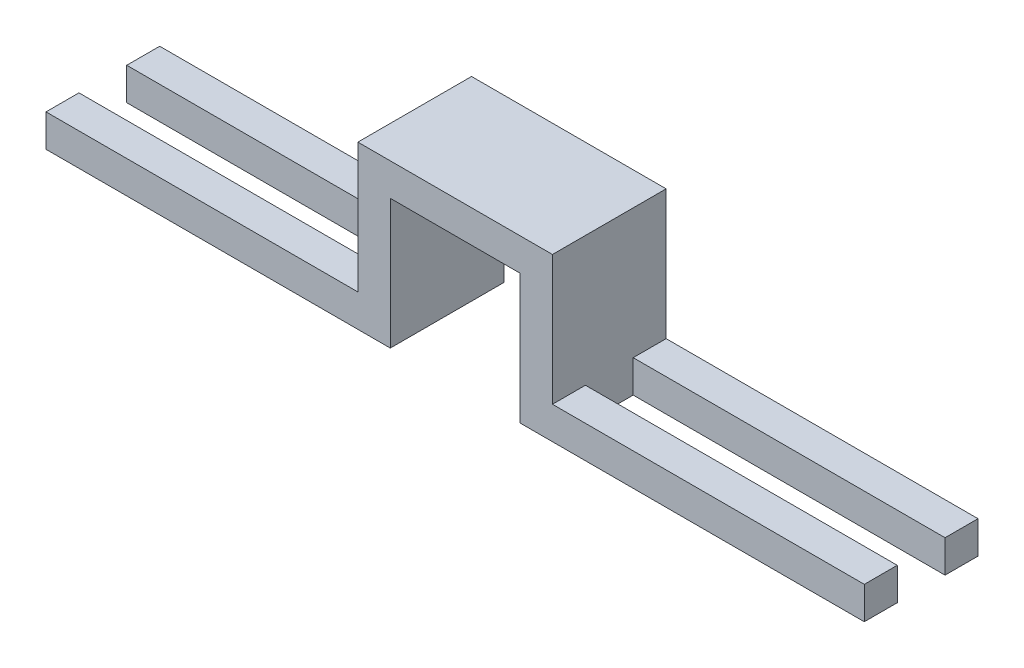
ISO-10303-21;
HEADER;
FILE_DESCRIPTION(('STEP AP214'),'2;1');
FILE_NAME('part.step','',(''),(''),'','','');
FILE_SCHEMA(('AUTOMOTIVE_DESIGN { 1 0 10303 214 1 1 1 1 }'));
ENDSEC;
DATA;
#1=APPLICATION_CONTEXT('core data for automotive mechanical design processes');
#2=APPLICATION_PROTOCOL_DEFINITION('international standard','automotive_design',2000,#1);
#3=PRODUCT_CONTEXT('',#1,'mechanical');
#4=PRODUCT('Part','Part','',(#3));
#5=PRODUCT_RELATED_PRODUCT_CATEGORY('part','',(#4));
#6=PRODUCT_DEFINITION_FORMATION('','',#4);
#7=PRODUCT_DEFINITION_CONTEXT('part definition',#1,'design');
#8=PRODUCT_DEFINITION('design','',#6,#7);
#9=PRODUCT_DEFINITION_SHAPE('','',#8);
#10=(LENGTH_UNIT() NAMED_UNIT(*) SI_UNIT(.MILLI.,.METRE.));
#11=(NAMED_UNIT(*) PLANE_ANGLE_UNIT() SI_UNIT($,.RADIAN.));
#12=(NAMED_UNIT(*) SI_UNIT($,.STERADIAN.) SOLID_ANGLE_UNIT());
#13=UNCERTAINTY_MEASURE_WITH_UNIT(LENGTH_MEASURE(1.E-05),#10,'distance_accuracy_value','');
#14=(GEOMETRIC_REPRESENTATION_CONTEXT(3) GLOBAL_UNCERTAINTY_ASSIGNED_CONTEXT((#13)) GLOBAL_UNIT_ASSIGNED_CONTEXT((#10,
#11,#12)) REPRESENTATION_CONTEXT('',''));
#15=CARTESIAN_POINT('',(0.,0.,0.));
#16=DIRECTION('',(0.,0.,1.));
#17=DIRECTION('',(1.,0.,0.));
#18=AXIS2_PLACEMENT_3D('',#15,#16,#17);
#19=CARTESIAN_POINT('',(0.,-10.0000000000001,17.526));
#20=DIRECTION('',(0.,1.,0.));
#21=DIRECTION('',(0.,0.,1.));
#22=AXIS2_PLACEMENT_3D('',#19,#20,#21);
#23=PLANE('',#22);
#24=DIRECTION('',(1.,0.,0.));
#25=VECTOR('',#24,1.);
#26=CARTESIAN_POINT('',(0.,-10.0000000000001,5.08));
#27=LINE('',#26,#25);
#28=CARTESIAN_POINT('',(14.9999999999999,-10.0000000000001,5.08));
#29=VERTEX_POINT('',#28);
#30=CARTESIAN_POINT('',(63.0734845670397,-10.0000000000001,5.08000000000001));
#31=VERTEX_POINT('',#30);
#32=EDGE_CURVE('E209',#29,#31,#27,.T.);
#33=ORIENTED_EDGE('',*,*,#32,.F.);
#34=DIRECTION('',(0.,0.,1.));
#35=VECTOR('',#34,1.);
#36=CARTESIAN_POINT('',(14.9999999999999,-10.0000000000001,0.));
#37=LINE('',#36,#35);
#38=CARTESIAN_POINT('',(14.9999999999999,-10.0000000000001,12.446));
#39=VERTEX_POINT('',#38);
#40=EDGE_CURVE('E212',#29,#39,#37,.T.);
#41=ORIENTED_EDGE('',*,*,#40,.T.);
#42=DIRECTION('',(1.,0.,0.));
#43=VECTOR('',#42,1.);
#44=CARTESIAN_POINT('',(0.,-10.0000000000001,12.446));
#45=LINE('',#44,#43);
#46=CARTESIAN_POINT('',(63.0734845670397,-10.0000000000001,12.446));
#47=VERTEX_POINT('',#46);
#48=EDGE_CURVE('E216',#39,#47,#45,.T.);
#49=ORIENTED_EDGE('',*,*,#48,.T.);
#50=DIRECTION('',(0.,0.,-1.));
#51=VECTOR('',#50,1.);
#52=CARTESIAN_POINT('',(63.0734845670397,-9.99999999999939,17.526));
#53=LINE('',#52,#51);
#54=CARTESIAN_POINT('',(63.0734845670397,-9.99999999999939,17.526));
#55=VERTEX_POINT('',#54);
#56=EDGE_CURVE('E11',#55,#47,#53,.T.);
#57=ORIENTED_EDGE('',*,*,#56,.F.);
#58=DIRECTION('',(1.,0.,0.));
#59=VECTOR('',#58,1.);
#60=CARTESIAN_POINT('',(0.,-10.0000000000001,17.526));
#61=LINE('',#60,#59);
#62=CARTESIAN_POINT('',(9.99999999999994,-10.0000000000001,17.526));
#63=VERTEX_POINT('',#62);
#64=EDGE_CURVE('E250',#63,#55,#61,.T.);
#65=ORIENTED_EDGE('',*,*,#64,.F.);
#66=DIRECTION('',(0.,0.,-1.));
#67=VECTOR('',#66,1.);
#68=CARTESIAN_POINT('',(9.99999999999994,-10.0000000000001,17.526));
#69=LINE('',#68,#67);
#70=CARTESIAN_POINT('',(9.99999999999994,-10.0000000000001,0.));
#71=VERTEX_POINT('',#70);
#72=EDGE_CURVE('E294',#63,#71,#69,.T.);
#73=ORIENTED_EDGE('',*,*,#72,.T.);
#74=DIRECTION('',(1.,0.,0.));
#75=VECTOR('',#74,1.);
#76=CARTESIAN_POINT('',(0.,-10.0000000000001,0.));
#77=LINE('',#76,#75);
#78=CARTESIAN_POINT('',(63.0734845670397,-9.99999999999939,0.));
#79=VERTEX_POINT('',#78);
#80=EDGE_CURVE('E249',#71,#79,#77,.T.);
#81=ORIENTED_EDGE('',*,*,#80,.T.);
#82=EDGE_CURVE('E49',#31,#79,#53,.T.);
#83=ORIENTED_EDGE('',*,*,#82,.F.);
#84=EDGE_LOOP('',(#33,#41,#49,#57,#65,#73,#81,#83));
#85=FACE_BOUND('',#84,.T.);
#86=ADVANCED_FACE('F41',(#85),#23,.F.);
#87=CARTESIAN_POINT('',(63.0734845670399,-1.40051269619353E-12,17.526));
#88=DIRECTION('',(-1.,0.,0.));
#89=DIRECTION('',(0.,-1.,0.));
#90=AXIS2_PLACEMENT_3D('',#87,#88,#89);
#91=PLANE('',#90);
#92=DIRECTION('',(0.,1.,0.));
#93=VECTOR('',#92,1.);
#94=CARTESIAN_POINT('',(63.0734845670399,-1.40051269619353E-12,5.08000000000001));
#95=LINE('',#94,#93);
#96=CARTESIAN_POINT('',(63.0734845670398,-5.00000000000006,5.08000000000001));
#97=VERTEX_POINT('',#96);
#98=EDGE_CURVE('E246',#31,#97,#95,.T.);
#99=ORIENTED_EDGE('',*,*,#98,.F.);
#100=ORIENTED_EDGE('',*,*,#82,.T.);
#101=DIRECTION('',(0.,1.,0.));
#102=VECTOR('',#101,1.);
#103=CARTESIAN_POINT('',(63.0734845670399,-1.40051269619353E-12,0.));
#104=LINE('',#103,#102);
#105=CARTESIAN_POINT('',(63.0734845670398,-5.00000000000006,0.));
#106=VERTEX_POINT('',#105);
#107=EDGE_CURVE('E298',#79,#106,#104,.T.);
#108=ORIENTED_EDGE('',*,*,#107,.T.);
#109=DIRECTION('',(0.,0.,-1.));
#110=VECTOR('',#109,1.);
#111=CARTESIAN_POINT('',(63.0734845670398,-5.00000000000006,17.526));
#112=LINE('',#111,#110);
#113=EDGE_CURVE('E375',#97,#106,#112,.T.);
#114=ORIENTED_EDGE('',*,*,#113,.F.);
#115=EDGE_LOOP('',(#99,#100,#108,#114));
#116=FACE_BOUND('',#115,.T.);
#117=ADVANCED_FACE('F392',(#116),#91,.F.);
#118=CARTESIAN_POINT('',(0.,-5.00000000000006,17.526));
#119=DIRECTION('',(0.,1.,0.));
#120=DIRECTION('',(-1.,0.,0.));
#121=AXIS2_PLACEMENT_3D('',#118,#119,#120);
#122=PLANE('',#121);
#123=DIRECTION('',(0.,0.,-1.));
#124=VECTOR('',#123,1.);
#125=CARTESIAN_POINT('',(14.9999999999999,-5.00000000000006,17.526));
#126=LINE('',#125,#124);
#127=CARTESIAN_POINT('',(14.9999999999999,-5.00000000000006,5.08));
#128=VERTEX_POINT('',#127);
#129=CARTESIAN_POINT('',(14.9999999999999,-5.00000000000006,0.));
#130=VERTEX_POINT('',#129);
#131=EDGE_CURVE('E371',#128,#130,#126,.T.);
#132=ORIENTED_EDGE('',*,*,#131,.F.);
#133=DIRECTION('',(1.,0.,0.));
#134=VECTOR('',#133,1.);
#135=CARTESIAN_POINT('',(0.,-5.00000000000006,5.08));
#136=LINE('',#135,#134);
#137=EDGE_CURVE('E242',#128,#97,#136,.T.);
#138=ORIENTED_EDGE('',*,*,#137,.T.);
#139=ORIENTED_EDGE('',*,*,#113,.T.);
#140=DIRECTION('',(1.,0.,0.));
#141=VECTOR('',#140,1.);
#142=CARTESIAN_POINT('',(0.,-5.00000000000006,0.));
#143=LINE('',#142,#141);
#144=EDGE_CURVE('E302',#130,#106,#143,.T.);
#145=ORIENTED_EDGE('',*,*,#144,.F.);
#146=EDGE_LOOP('',(#132,#138,#139,#145));
#147=FACE_BOUND('',#146,.T.);
#148=ADVANCED_FACE('F388',(#147),#122,.T.);
#149=CARTESIAN_POINT('',(0.,-5.00000000000006,17.526));
#150=DIRECTION('',(0.,-1.,0.));
#151=DIRECTION('',(1.,0.,0.));
#152=AXIS2_PLACEMENT_3D('',#149,#150,#151);
#153=PLANE('',#152);
#154=DIRECTION('',(1.,0.,0.));
#155=VECTOR('',#154,1.);
#156=CARTESIAN_POINT('',(0.,-5.00000000000006,12.446));
#157=LINE('',#156,#155);
#158=CARTESIAN_POINT('',(-63.0734845670398,-5.00000000000007,12.446));
#159=VERTEX_POINT('',#158);
#160=CARTESIAN_POINT('',(-14.9999999999999,-5.00000000000007,12.446));
#161=VERTEX_POINT('',#160);
#162=EDGE_CURVE('E227',#159,#161,#157,.T.);
#163=ORIENTED_EDGE('',*,*,#162,.F.);
#164=DIRECTION('',(0.,0.,-1.));
#165=VECTOR('',#164,1.);
#166=CARTESIAN_POINT('',(-63.0734845670398,-5.00000000000007,17.526));
#167=LINE('',#166,#165);
#168=CARTESIAN_POINT('',(-63.0734845670398,-5.00000000000007,17.526));
#169=VERTEX_POINT('',#168);
#170=EDGE_CURVE('E357',#169,#159,#167,.T.);
#171=ORIENTED_EDGE('',*,*,#170,.F.);
#172=DIRECTION('',(-1.,0.,0.));
#173=VECTOR('',#172,1.);
#174=CARTESIAN_POINT('',(0.,-5.00000000000006,17.526));
#175=LINE('',#174,#173);
#176=CARTESIAN_POINT('',(-14.9999999999999,-5.00000000000007,17.526));
#177=VERTEX_POINT('',#176);
#178=EDGE_CURVE('E273',#177,#169,#175,.T.);
#179=ORIENTED_EDGE('',*,*,#178,.F.);
#180=DIRECTION('',(0.,0.,-1.));
#181=VECTOR('',#180,1.);
#182=CARTESIAN_POINT('',(-14.9999999999999,-5.00000000000007,17.526));
#183=LINE('',#182,#181);
#184=EDGE_CURVE('E361',#177,#161,#183,.T.);
#185=ORIENTED_EDGE('',*,*,#184,.T.);
#186=EDGE_LOOP('',(#163,#171,#179,#185));
#187=FACE_BOUND('',#186,.T.);
#188=ADVANCED_FACE('F434',(#187),#153,.F.);
#189=CARTESIAN_POINT('',(-63.0734845670398,0.,17.526));
#190=DIRECTION('',(-1.,0.,0.));
#191=DIRECTION('',(0.,0.,1.));
#192=AXIS2_PLACEMENT_3D('',#189,#190,#191);
#193=PLANE('',#192);
#194=ORIENTED_EDGE('',*,*,#170,.T.);
#195=DIRECTION('',(0.,-1.,0.));
#196=VECTOR('',#195,1.);
#197=CARTESIAN_POINT('',(-63.0734845670398,0.,12.446));
#198=LINE('',#197,#196);
#199=CARTESIAN_POINT('',(-63.0734845670398,-10.0000000000001,12.446));
#200=VERTEX_POINT('',#199);
#201=EDGE_CURVE('E185',#159,#200,#198,.T.);
#202=ORIENTED_EDGE('',*,*,#201,.T.);
#203=DIRECTION('',(0.,0.,-1.));
#204=VECTOR('',#203,1.);
#205=CARTESIAN_POINT('',(-63.0734845670398,-10.0000000000001,17.526));
#206=LINE('',#205,#204);
#207=CARTESIAN_POINT('',(-63.0734845670398,-10.0000000000001,17.526));
#208=VERTEX_POINT('',#207);
#209=EDGE_CURVE('E353',#208,#200,#206,.T.);
#210=ORIENTED_EDGE('',*,*,#209,.F.);
#211=DIRECTION('',(0.,1.,0.));
#212=VECTOR('',#211,1.);
#213=CARTESIAN_POINT('',(-63.0734845670398,0.,17.526));
#214=LINE('',#213,#212);
#215=EDGE_CURVE('E276',#208,#169,#214,.T.);
#216=ORIENTED_EDGE('',*,*,#215,.T.);
#217=EDGE_LOOP('',(#194,#202,#210,#216));
#218=FACE_BOUND('',#217,.T.);
#219=ADVANCED_FACE('F428',(#218),#193,.T.);
#220=ORIENTED_EDGE('',*,*,#56,.T.);
#221=DIRECTION('',(0.,1.,0.));
#222=VECTOR('',#221,1.);
#223=CARTESIAN_POINT('',(63.0734845670399,-1.40051269619353E-12,12.446));
#224=LINE('',#223,#222);
#225=CARTESIAN_POINT('',(63.0734845670398,-5.00000000000006,12.446));
#226=VERTEX_POINT('',#225);
#227=EDGE_CURVE('E238',#47,#226,#224,.T.);
#228=ORIENTED_EDGE('',*,*,#227,.T.);
#229=CARTESIAN_POINT('',(63.0734845670398,-5.00000000000006,17.526));
#230=VERTEX_POINT('',#229);
#231=EDGE_CURVE('E376',#230,#226,#112,.T.);
#232=ORIENTED_EDGE('',*,*,#231,.F.);
#233=DIRECTION('',(0.,1.,0.));
#234=VECTOR('',#233,1.);
#235=CARTESIAN_POINT('',(63.0734845670399,-1.40051269619353E-12,17.526));
#236=LINE('',#235,#234);
#237=EDGE_CURVE('E254',#55,#230,#236,.T.);
#238=ORIENTED_EDGE('',*,*,#237,.F.);
#239=EDGE_LOOP('',(#220,#228,#232,#238));
#240=FACE_BOUND('',#239,.T.);
#241=ADVANCED_FACE('F457',(#240),#91,.F.);
#242=DIRECTION('',(1.,0.,0.));
#243=VECTOR('',#242,1.);
#244=CARTESIAN_POINT('',(0.,-5.00000000000006,12.446));
#245=LINE('',#244,#243);
#246=CARTESIAN_POINT('',(14.9999999999999,-5.00000000000006,12.446));
#247=VERTEX_POINT('',#246);
#248=EDGE_CURVE('E235',#247,#226,#245,.T.);
#249=ORIENTED_EDGE('',*,*,#248,.F.);
#250=CARTESIAN_POINT('',(14.9999999999999,-5.00000000000006,17.526));
#251=VERTEX_POINT('',#250);
#252=EDGE_CURVE('E372',#251,#247,#126,.T.);
#253=ORIENTED_EDGE('',*,*,#252,.F.);
#254=DIRECTION('',(1.,0.,0.));
#255=VECTOR('',#254,1.);
#256=CARTESIAN_POINT('',(0.,-5.00000000000006,17.526));
#257=LINE('',#256,#255);
#258=EDGE_CURVE('E258',#251,#230,#257,.T.);
#259=ORIENTED_EDGE('',*,*,#258,.T.);
#260=ORIENTED_EDGE('',*,*,#231,.T.);
#261=EDGE_LOOP('',(#249,#253,#259,#260));
#262=FACE_BOUND('',#261,.T.);
#263=ADVANCED_FACE('F538',(#262),#122,.T.);
#264=CARTESIAN_POINT('',(14.9999999999999,0.,17.526));
#265=DIRECTION('',(-1.,0.,0.));
#266=DIRECTION('',(0.,-1.,0.));
#267=AXIS2_PLACEMENT_3D('',#264,#265,#266);
#268=PLANE('',#267);
#269=ORIENTED_EDGE('',*,*,#252,.T.);
#270=DIRECTION('',(0.,1.,0.));
#271=VECTOR('',#270,1.);
#272=CARTESIAN_POINT('',(14.9999999999999,-10.0000000000001,12.446));
#273=LINE('',#272,#271);
#274=EDGE_CURVE('E204',#39,#247,#273,.T.);
#275=ORIENTED_EDGE('',*,*,#274,.F.);
#276=ORIENTED_EDGE('',*,*,#40,.F.);
#277=DIRECTION('',(0.,1.,0.));
#278=VECTOR('',#277,1.);
#279=CARTESIAN_POINT('',(14.9999999999999,-10.0000000000001,5.08));
#280=LINE('',#279,#278);
#281=EDGE_CURVE('E56',#29,#128,#280,.T.);
#282=ORIENTED_EDGE('',*,*,#281,.T.);
#283=ORIENTED_EDGE('',*,*,#131,.T.);
#284=DIRECTION('',(0.,1.,0.));
#285=VECTOR('',#284,1.);
#286=CARTESIAN_POINT('',(14.9999999999999,0.,0.));
#287=LINE('',#286,#285);
#288=CARTESIAN_POINT('',(14.9999999999999,14.9999999999999,0.));
#289=VERTEX_POINT('',#288);
#290=EDGE_CURVE('E306',#130,#289,#287,.T.);
#291=ORIENTED_EDGE('',*,*,#290,.T.);
#292=DIRECTION('',(0.,0.,-1.));
#293=VECTOR('',#292,1.);
#294=CARTESIAN_POINT('',(14.9999999999999,14.9999999999999,17.526));
#295=LINE('',#294,#293);
#296=CARTESIAN_POINT('',(14.9999999999999,14.9999999999999,17.526));
#297=VERTEX_POINT('',#296);
#298=EDGE_CURVE('E368',#297,#289,#295,.T.);
#299=ORIENTED_EDGE('',*,*,#298,.F.);
#300=DIRECTION('',(0.,1.,0.));
#301=VECTOR('',#300,1.);
#302=CARTESIAN_POINT('',(14.9999999999999,0.,17.526));
#303=LINE('',#302,#301);
#304=EDGE_CURVE('E262',#251,#297,#303,.T.);
#305=ORIENTED_EDGE('',*,*,#304,.F.);
#306=EDGE_LOOP('',(#269,#275,#276,#282,#283,#291,#299,#305));
#307=FACE_BOUND('',#306,.T.);
#308=ADVANCED_FACE('F400',(#307),#268,.F.);
#309=CARTESIAN_POINT('',(0.,14.9999999999999,17.526));
#310=DIRECTION('',(0.,1.,0.));
#311=DIRECTION('',(0.,0.,1.));
#312=AXIS2_PLACEMENT_3D('',#309,#310,#311);
#313=PLANE('',#312);
#314=DIRECTION('',(1.,0.,0.));
#315=VECTOR('',#314,1.);
#316=CARTESIAN_POINT('',(0.,14.9999999999999,0.));
#317=LINE('',#316,#315);
#318=CARTESIAN_POINT('',(-15.0000000000001,14.9999999999999,0.));
#319=VERTEX_POINT('',#318);
#320=EDGE_CURVE('E310',#319,#289,#317,.T.);
#321=ORIENTED_EDGE('',*,*,#320,.F.);
#322=DIRECTION('',(0.,0.,-1.));
#323=VECTOR('',#322,1.);
#324=CARTESIAN_POINT('',(-15.0000000000001,14.9999999999999,17.526));
#325=LINE('',#324,#323);
#326=CARTESIAN_POINT('',(-15.0000000000001,14.9999999999999,17.526));
#327=VERTEX_POINT('',#326);
#328=EDGE_CURVE('E365',#327,#319,#325,.T.);
#329=ORIENTED_EDGE('',*,*,#328,.F.);
#330=DIRECTION('',(1.,0.,0.));
#331=VECTOR('',#330,1.);
#332=CARTESIAN_POINT('',(0.,14.9999999999999,17.526));
#333=LINE('',#332,#331);
#334=EDGE_CURVE('E265',#327,#297,#333,.T.);
#335=ORIENTED_EDGE('',*,*,#334,.T.);
#336=ORIENTED_EDGE('',*,*,#298,.T.);
#337=EDGE_LOOP('',(#321,#329,#335,#336));
#338=FACE_BOUND('',#337,.T.);
#339=ADVANCED_FACE('F440',(#338),#313,.T.);
#340=CARTESIAN_POINT('',(-15.,0.,17.526));
#341=DIRECTION('',(-1.,0.,0.));
#342=DIRECTION('',(0.,-1.,0.));
#343=AXIS2_PLACEMENT_3D('',#340,#341,#342);
#344=PLANE('',#343);
#345=CARTESIAN_POINT('',(-14.9999999999999,-5.00000000000007,5.08));
#346=VERTEX_POINT('',#345);
#347=CARTESIAN_POINT('',(-14.9999999999999,-5.00000000000007,0.));
#348=VERTEX_POINT('',#347);
#349=EDGE_CURVE('E181',#346,#348,#183,.T.);
#350=ORIENTED_EDGE('',*,*,#349,.F.);
#351=DIRECTION('',(0.,1.,0.));
#352=VECTOR('',#351,1.);
#353=CARTESIAN_POINT('',(-14.9999999999999,-10.0000000000001,5.08));
#354=LINE('',#353,#352);
#355=CARTESIAN_POINT('',(-14.9999999999999,-10.0000000000001,5.08));
#356=VERTEX_POINT('',#355);
#357=EDGE_CURVE('E177',#356,#346,#354,.T.);
#358=ORIENTED_EDGE('',*,*,#357,.F.);
#359=DIRECTION('',(0.,0.,-1.));
#360=VECTOR('',#359,1.);
#361=CARTESIAN_POINT('',(-14.9999999999999,-10.0000000000001,0.));
#362=LINE('',#361,#360);
#363=CARTESIAN_POINT('',(-14.9999999999999,-10.0000000000001,12.446));
#364=VERTEX_POINT('',#363);
#365=EDGE_CURVE('E64',#364,#356,#362,.T.);
#366=ORIENTED_EDGE('',*,*,#365,.F.);
#367=DIRECTION('',(0.,1.,0.));
#368=VECTOR('',#367,1.);
#369=CARTESIAN_POINT('',(-14.9999999999999,-10.0000000000001,12.446));
#370=LINE('',#369,#368);
#371=EDGE_CURVE('E186',#364,#161,#370,.T.);
#372=ORIENTED_EDGE('',*,*,#371,.T.);
#373=ORIENTED_EDGE('',*,*,#184,.F.);
#374=DIRECTION('',(0.,1.,0.));
#375=VECTOR('',#374,1.);
#376=CARTESIAN_POINT('',(-15.,0.,17.526));
#377=LINE('',#376,#375);
#378=EDGE_CURVE('E269',#177,#327,#377,.T.);
#379=ORIENTED_EDGE('',*,*,#378,.T.);
#380=ORIENTED_EDGE('',*,*,#328,.T.);
#381=DIRECTION('',(0.,1.,0.));
#382=VECTOR('',#381,1.);
#383=CARTESIAN_POINT('',(-15.,0.,0.));
#384=LINE('',#383,#382);
#385=EDGE_CURVE('E314',#348,#319,#384,.T.);
#386=ORIENTED_EDGE('',*,*,#385,.F.);
#387=EDGE_LOOP('',(#350,#358,#366,#372,#373,#379,#380,#386));
#388=FACE_BOUND('',#387,.T.);
#389=ADVANCED_FACE('F179',(#388),#344,.T.);
#390=CARTESIAN_POINT('',(-63.0734845670398,-5.00000000000007,5.08000000000001));
#391=VERTEX_POINT('',#390);
#392=CARTESIAN_POINT('',(-63.0734845670398,-5.00000000000007,0.));
#393=VERTEX_POINT('',#392);
#394=EDGE_CURVE('E356',#391,#393,#167,.T.);
#395=ORIENTED_EDGE('',*,*,#394,.F.);
#396=DIRECTION('',(1.,0.,0.));
#397=VECTOR('',#396,1.);
#398=CARTESIAN_POINT('',(0.,-5.00000000000006,5.08));
#399=LINE('',#398,#397);
#400=EDGE_CURVE('E232',#391,#346,#399,.T.);
#401=ORIENTED_EDGE('',*,*,#400,.T.);
#402=ORIENTED_EDGE('',*,*,#349,.T.);
#403=DIRECTION('',(-1.,0.,0.));
#404=VECTOR('',#403,1.);
#405=CARTESIAN_POINT('',(0.,-5.00000000000006,0.));
#406=LINE('',#405,#404);
#407=EDGE_CURVE('E318',#348,#393,#406,.T.);
#408=ORIENTED_EDGE('',*,*,#407,.T.);
#409=EDGE_LOOP('',(#395,#401,#402,#408));
#410=FACE_BOUND('',#409,.T.);
#411=ADVANCED_FACE('F442',(#410),#153,.F.);
#412=DIRECTION('',(0.,-1.,0.));
#413=VECTOR('',#412,1.);
#414=CARTESIAN_POINT('',(-63.0734845670398,0.,5.08000000000001));
#415=LINE('',#414,#413);
#416=CARTESIAN_POINT('',(-63.0734845670398,-10.0000000000001,5.08000000000001));
#417=VERTEX_POINT('',#416);
#418=EDGE_CURVE('E192',#391,#417,#415,.T.);
#419=ORIENTED_EDGE('',*,*,#418,.F.);
#420=ORIENTED_EDGE('',*,*,#394,.T.);
#421=DIRECTION('',(0.,1.,0.));
#422=VECTOR('',#421,1.);
#423=CARTESIAN_POINT('',(-63.0734845670398,0.,0.));
#424=LINE('',#423,#422);
#425=CARTESIAN_POINT('',(-63.0734845670398,-10.0000000000001,0.));
#426=VERTEX_POINT('',#425);
#427=EDGE_CURVE('E322',#426,#393,#424,.T.);
#428=ORIENTED_EDGE('',*,*,#427,.F.);
#429=EDGE_CURVE('E352',#417,#426,#206,.T.);
#430=ORIENTED_EDGE('',*,*,#429,.F.);
#431=EDGE_LOOP('',(#419,#420,#428,#430));
#432=FACE_BOUND('',#431,.T.);
#433=ADVANCED_FACE('F409',(#432),#193,.T.);
#434=CARTESIAN_POINT('',(0.,-10.0000000000001,17.526));
#435=DIRECTION('',(0.,-1.,0.));
#436=DIRECTION('',(0.,0.,-1.));
#437=AXIS2_PLACEMENT_3D('',#434,#435,#436);
#438=PLANE('',#437);
#439=DIRECTION('',(-1.,0.,0.));
#440=VECTOR('',#439,1.);
#441=CARTESIAN_POINT('',(0.,-10.0000000000001,5.08));
#442=LINE('',#441,#440);
#443=EDGE_CURVE('E189',#356,#417,#442,.T.);
#444=ORIENTED_EDGE('',*,*,#443,.T.);
#445=ORIENTED_EDGE('',*,*,#429,.T.);
#446=DIRECTION('',(-1.,0.,0.));
#447=VECTOR('',#446,1.);
#448=CARTESIAN_POINT('',(0.,-10.0000000000001,0.));
#449=LINE('',#448,#447);
#450=CARTESIAN_POINT('',(-10.0000000000001,-10.0000000000001,0.));
#451=VERTEX_POINT('',#450);
#452=EDGE_CURVE('E326',#451,#426,#449,.T.);
#453=ORIENTED_EDGE('',*,*,#452,.F.);
#454=DIRECTION('',(0.,0.,-1.));
#455=VECTOR('',#454,1.);
#456=CARTESIAN_POINT('',(-10.0000000000001,-10.0000000000001,17.526));
#457=LINE('',#456,#455);
#458=CARTESIAN_POINT('',(-10.0000000000001,-10.0000000000001,17.526));
#459=VERTEX_POINT('',#458);
#460=EDGE_CURVE('E349',#459,#451,#457,.T.);
#461=ORIENTED_EDGE('',*,*,#460,.F.);
#462=DIRECTION('',(-1.,0.,0.));
#463=VECTOR('',#462,1.);
#464=CARTESIAN_POINT('',(0.,-10.0000000000001,17.526));
#465=LINE('',#464,#463);
#466=EDGE_CURVE('E280',#459,#208,#465,.T.);
#467=ORIENTED_EDGE('',*,*,#466,.T.);
#468=ORIENTED_EDGE('',*,*,#209,.T.);
#469=DIRECTION('',(-1.,0.,0.));
#470=VECTOR('',#469,1.);
#471=CARTESIAN_POINT('',(0.,-10.0000000000001,12.446));
#472=LINE('',#471,#470);
#473=EDGE_CURVE('E200',#364,#200,#472,.T.);
#474=ORIENTED_EDGE('',*,*,#473,.F.);
#475=ORIENTED_EDGE('',*,*,#365,.T.);
#476=EDGE_LOOP('',(#444,#445,#453,#461,#467,#468,#474,#475));
#477=FACE_BOUND('',#476,.T.);
#478=ADVANCED_FACE('F198',(#477),#438,.T.);
#479=CARTESIAN_POINT('',(-10.0000000000001,0.,17.526));
#480=DIRECTION('',(-1.,0.,0.));
#481=DIRECTION('',(0.,0.,1.));
#482=AXIS2_PLACEMENT_3D('',#479,#480,#481);
#483=PLANE('',#482);
#484=DIRECTION('',(0.,1.,0.));
#485=VECTOR('',#484,1.);
#486=CARTESIAN_POINT('',(-10.0000000000001,0.,0.));
#487=LINE('',#486,#485);
#488=CARTESIAN_POINT('',(-10.0000000000001,9.99999999999995,0.));
#489=VERTEX_POINT('',#488);
#490=EDGE_CURVE('E330',#451,#489,#487,.T.);
#491=ORIENTED_EDGE('',*,*,#490,.T.);
#492=DIRECTION('',(0.,0.,-1.));
#493=VECTOR('',#492,1.);
#494=CARTESIAN_POINT('',(-10.0000000000001,9.99999999999995,17.526));
#495=LINE('',#494,#493);
#496=CARTESIAN_POINT('',(-10.0000000000001,9.99999999999995,17.526));
#497=VERTEX_POINT('',#496);
#498=EDGE_CURVE('E345',#497,#489,#495,.T.);
#499=ORIENTED_EDGE('',*,*,#498,.F.);
#500=DIRECTION('',(0.,1.,0.));
#501=VECTOR('',#500,1.);
#502=CARTESIAN_POINT('',(-10.0000000000001,0.,17.526));
#503=LINE('',#502,#501);
#504=EDGE_CURVE('E284',#459,#497,#503,.T.);
#505=ORIENTED_EDGE('',*,*,#504,.F.);
#506=ORIENTED_EDGE('',*,*,#460,.T.);
#507=EDGE_LOOP('',(#491,#499,#505,#506));
#508=FACE_BOUND('',#507,.T.);
#509=ADVANCED_FACE('F416',(#508),#483,.F.);
#510=CARTESIAN_POINT('',(0.,9.99999999999995,17.526));
#511=DIRECTION('',(0.,1.,0.));
#512=DIRECTION('',(0.,0.,1.));
#513=AXIS2_PLACEMENT_3D('',#510,#511,#512);
#514=PLANE('',#513);
#515=DIRECTION('',(1.,0.,0.));
#516=VECTOR('',#515,1.);
#517=CARTESIAN_POINT('',(0.,9.99999999999995,0.));
#518=LINE('',#517,#516);
#519=CARTESIAN_POINT('',(9.99999999999994,9.99999999999995,0.));
#520=VERTEX_POINT('',#519);
#521=EDGE_CURVE('E333',#489,#520,#518,.T.);
#522=ORIENTED_EDGE('',*,*,#521,.T.);
#523=DIRECTION('',(0.,0.,-1.));
#524=VECTOR('',#523,1.);
#525=CARTESIAN_POINT('',(9.99999999999994,9.99999999999995,17.526));
#526=LINE('',#525,#524);
#527=CARTESIAN_POINT('',(9.99999999999994,9.99999999999995,17.526));
#528=VERTEX_POINT('',#527);
#529=EDGE_CURVE('E342',#528,#520,#526,.T.);
#530=ORIENTED_EDGE('',*,*,#529,.F.);
#531=DIRECTION('',(1.,0.,0.));
#532=VECTOR('',#531,1.);
#533=CARTESIAN_POINT('',(0.,9.99999999999995,17.526));
#534=LINE('',#533,#532);
#535=EDGE_CURVE('E287',#497,#528,#534,.T.);
#536=ORIENTED_EDGE('',*,*,#535,.F.);
#537=ORIENTED_EDGE('',*,*,#498,.T.);
#538=EDGE_LOOP('',(#522,#530,#536,#537));
#539=FACE_BOUND('',#538,.T.);
#540=ADVANCED_FACE('F420',(#539),#514,.F.);
#541=CARTESIAN_POINT('',(9.99999999999994,0.,17.526));
#542=DIRECTION('',(-1.,0.,0.));
#543=DIRECTION('',(0.,0.,1.));
#544=AXIS2_PLACEMENT_3D('',#541,#542,#543);
#545=PLANE('',#544);
#546=DIRECTION('',(0.,1.,0.));
#547=VECTOR('',#546,1.);
#548=CARTESIAN_POINT('',(9.99999999999994,0.,0.));
#549=LINE('',#548,#547);
#550=EDGE_CURVE('E255',#71,#520,#549,.T.);
#551=ORIENTED_EDGE('',*,*,#550,.F.);
#552=ORIENTED_EDGE('',*,*,#72,.F.);
#553=DIRECTION('',(0.,1.,0.));
#554=VECTOR('',#553,1.);
#555=CARTESIAN_POINT('',(9.99999999999994,0.,17.526));
#556=LINE('',#555,#554);
#557=EDGE_CURVE('E290',#63,#528,#556,.T.);
#558=ORIENTED_EDGE('',*,*,#557,.T.);
#559=ORIENTED_EDGE('',*,*,#529,.T.);
#560=EDGE_LOOP('',(#551,#552,#558,#559));
#561=FACE_BOUND('',#560,.T.);
#562=ADVANCED_FACE('F469',(#561),#545,.T.);
#563=CARTESIAN_POINT('',(0.,0.,17.526));
#564=DIRECTION('',(0.,0.,1.));
#565=DIRECTION('',(1.,0.,0.));
#566=AXIS2_PLACEMENT_3D('',#563,#564,#565);
#567=PLANE('',#566);
#568=ORIENTED_EDGE('',*,*,#64,.T.);
#569=ORIENTED_EDGE('',*,*,#237,.T.);
#570=ORIENTED_EDGE('',*,*,#258,.F.);
#571=ORIENTED_EDGE('',*,*,#304,.T.);
#572=ORIENTED_EDGE('',*,*,#334,.F.);
#573=ORIENTED_EDGE('',*,*,#378,.F.);
#574=ORIENTED_EDGE('',*,*,#178,.T.);
#575=ORIENTED_EDGE('',*,*,#215,.F.);
#576=ORIENTED_EDGE('',*,*,#466,.F.);
#577=ORIENTED_EDGE('',*,*,#504,.T.);
#578=ORIENTED_EDGE('',*,*,#535,.T.);
#579=ORIENTED_EDGE('',*,*,#557,.F.);
#580=EDGE_LOOP('',(#568,#569,#570,#571,#572,#573,#574,#575,#576,#577,#578,#579));
#581=FACE_BOUND('',#580,.T.);
#582=ADVANCED_FACE('F424',(#581),#567,.T.);
#583=CARTESIAN_POINT('',(0.,0.,0.));
#584=DIRECTION('',(0.,0.,1.));
#585=DIRECTION('',(1.,0.,0.));
#586=AXIS2_PLACEMENT_3D('',#583,#584,#585);
#587=PLANE('',#586);
#588=ORIENTED_EDGE('',*,*,#80,.F.);
#589=ORIENTED_EDGE('',*,*,#550,.T.);
#590=ORIENTED_EDGE('',*,*,#521,.F.);
#591=ORIENTED_EDGE('',*,*,#490,.F.);
#592=ORIENTED_EDGE('',*,*,#452,.T.);
#593=ORIENTED_EDGE('',*,*,#427,.T.);
#594=ORIENTED_EDGE('',*,*,#407,.F.);
#595=ORIENTED_EDGE('',*,*,#385,.T.);
#596=ORIENTED_EDGE('',*,*,#320,.T.);
#597=ORIENTED_EDGE('',*,*,#290,.F.);
#598=ORIENTED_EDGE('',*,*,#144,.T.);
#599=ORIENTED_EDGE('',*,*,#107,.F.);
#600=EDGE_LOOP('',(#588,#589,#590,#591,#592,#593,#594,#595,#596,#597,#598,#599));
#601=FACE_BOUND('',#600,.T.);
#602=ADVANCED_FACE('F397',(#601),#587,.F.);
#603=CARTESIAN_POINT('',(0.,-10.0000000000001,5.08));
#604=DIRECTION('',(0.,0.,-1.));
#605=DIRECTION('',(-1.,0.,0.));
#606=AXIS2_PLACEMENT_3D('',#603,#604,#605);
#607=PLANE('',#606);
#608=ORIENTED_EDGE('',*,*,#418,.T.);
#609=ORIENTED_EDGE('',*,*,#443,.F.);
#610=ORIENTED_EDGE('',*,*,#357,.T.);
#611=ORIENTED_EDGE('',*,*,#400,.F.);
#612=EDGE_LOOP('',(#608,#609,#610,#611));
#613=FACE_BOUND('',#612,.T.);
#614=ADVANCED_FACE('F190',(#613),#607,.F.);
#615=CARTESIAN_POINT('',(0.,-10.0000000000001,12.446));
#616=DIRECTION('',(0.,0.,-1.));
#617=DIRECTION('',(-1.,0.,0.));
#618=AXIS2_PLACEMENT_3D('',#615,#616,#617);
#619=PLANE('',#618);
#620=ORIENTED_EDGE('',*,*,#162,.T.);
#621=ORIENTED_EDGE('',*,*,#371,.F.);
#622=ORIENTED_EDGE('',*,*,#473,.T.);
#623=ORIENTED_EDGE('',*,*,#201,.F.);
#624=EDGE_LOOP('',(#620,#621,#622,#623));
#625=FACE_BOUND('',#624,.T.);
#626=ADVANCED_FACE('F432',(#625),#619,.T.);
#627=CARTESIAN_POINT('',(0.,-10.0000000000001,5.08));
#628=DIRECTION('',(0.,0.,1.));
#629=DIRECTION('',(1.,0.,0.));
#630=AXIS2_PLACEMENT_3D('',#627,#628,#629);
#631=PLANE('',#630);
#632=ORIENTED_EDGE('',*,*,#98,.T.);
#633=ORIENTED_EDGE('',*,*,#137,.F.);
#634=ORIENTED_EDGE('',*,*,#281,.F.);
#635=ORIENTED_EDGE('',*,*,#32,.T.);
#636=EDGE_LOOP('',(#632,#633,#634,#635));
#637=FACE_BOUND('',#636,.T.);
#638=ADVANCED_FACE('F460',(#637),#631,.T.);
#639=CARTESIAN_POINT('',(0.,-10.0000000000001,12.446));
#640=DIRECTION('',(0.,0.,1.));
#641=DIRECTION('',(1.,0.,0.));
#642=AXIS2_PLACEMENT_3D('',#639,#640,#641);
#643=PLANE('',#642);
#644=ORIENTED_EDGE('',*,*,#48,.F.);
#645=ORIENTED_EDGE('',*,*,#274,.T.);
#646=ORIENTED_EDGE('',*,*,#248,.T.);
#647=ORIENTED_EDGE('',*,*,#227,.F.);
#648=EDGE_LOOP('',(#644,#645,#646,#647));
#649=FACE_BOUND('',#648,.T.);
#650=ADVANCED_FACE('F463',(#649),#643,.F.);
#651=CLOSED_SHELL('',(#86,#117,#148,#188,#219,#241,#263,#308,#339,#389,#411,#433,#478,#509,#540,
#562,#582,#602,#614,#626,#638,#650));
#652=MANIFOLD_SOLID_BREP('B2',#651);
#653=ADVANCED_BREP_SHAPE_REPRESENTATION('',(#18,#652),#14);
#654=SHAPE_DEFINITION_REPRESENTATION(#9,#653);
ENDSEC;
END-ISO-10303-21;
